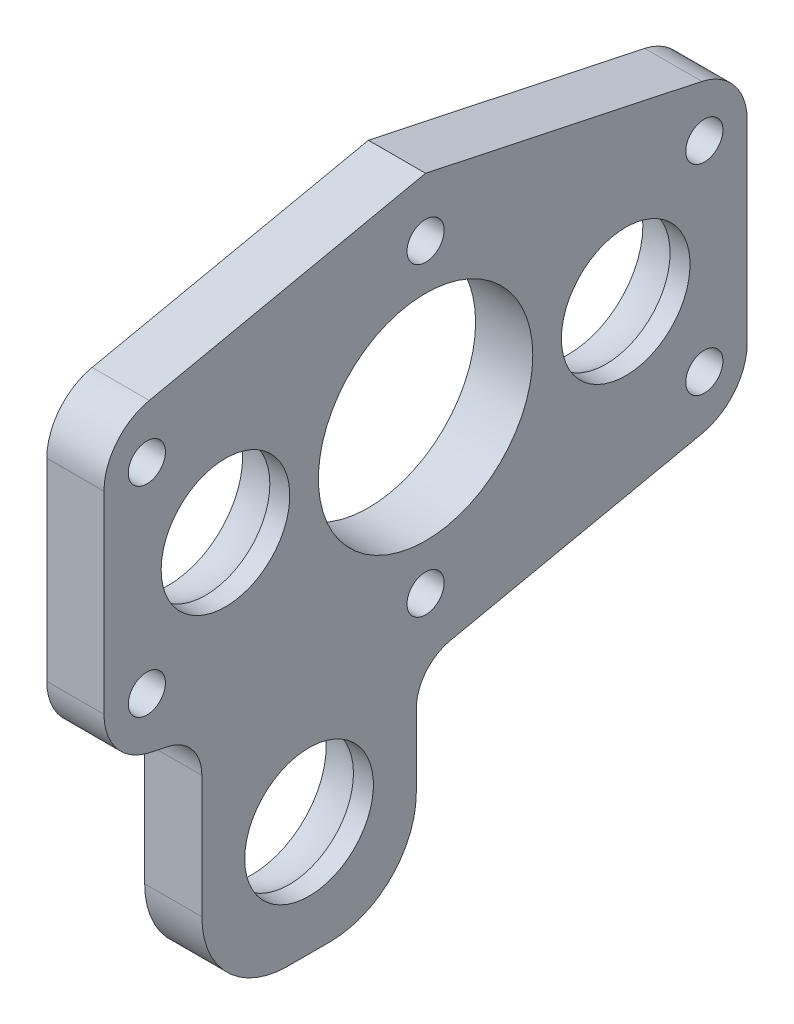
ISO-10303-21;
HEADER;
FILE_DESCRIPTION(('STEP AP214'),'2;1');
FILE_NAME('part.step','',(''),(''),'','','');
FILE_SCHEMA(('AUTOMOTIVE_DESIGN { 1 0 10303 214 1 1 1 1 }'));
ENDSEC;
DATA;
#1=APPLICATION_CONTEXT('core data for automotive mechanical design processes');
#2=APPLICATION_PROTOCOL_DEFINITION('international standard','automotive_design',2000,#1);
#3=PRODUCT_CONTEXT('',#1,'mechanical');
#4=PRODUCT('Part','Part','',(#3));
#5=PRODUCT_RELATED_PRODUCT_CATEGORY('part','',(#4));
#6=PRODUCT_DEFINITION_FORMATION('','',#4);
#7=PRODUCT_DEFINITION_CONTEXT('part definition',#1,'design');
#8=PRODUCT_DEFINITION('design','',#6,#7);
#9=PRODUCT_DEFINITION_SHAPE('','',#8);
#10=(LENGTH_UNIT() NAMED_UNIT(*) SI_UNIT(.MILLI.,.METRE.));
#11=(NAMED_UNIT(*) PLANE_ANGLE_UNIT() SI_UNIT($,.RADIAN.));
#12=(NAMED_UNIT(*) SI_UNIT($,.STERADIAN.) SOLID_ANGLE_UNIT());
#13=UNCERTAINTY_MEASURE_WITH_UNIT(LENGTH_MEASURE(1.E-05),#10,'distance_accuracy_value','');
#14=(GEOMETRIC_REPRESENTATION_CONTEXT(3) GLOBAL_UNCERTAINTY_ASSIGNED_CONTEXT((#13)) GLOBAL_UNIT_ASSIGNED_CONTEXT((#10,
#11,#12)) REPRESENTATION_CONTEXT('',''));
#15=CARTESIAN_POINT('',(0.,0.,0.));
#16=DIRECTION('',(0.,0.,1.));
#17=DIRECTION('',(1.,0.,0.));
#18=AXIS2_PLACEMENT_3D('',#15,#16,#17);
#19=CARTESIAN_POINT('',(4.,-28.2690306373786,-5.99265255801159));
#20=DIRECTION('',(0.,0.978260869565218,0.207378087264554));
#21=DIRECTION('',(0.,-0.207378087264554,0.978260869565218));
#22=AXIS2_PLACEMENT_3D('',#19,#20,#21);
#23=PLANE('',#22);
#24=DIRECTION('',(0.,0.207378087264554,-0.978260869565218));
#25=VECTOR('',#24,1.);
#26=CARTESIAN_POINT('',(4.,-28.2690306373786,-5.99265255801159));
#27=LINE('',#26,#25);
#28=CARTESIAN_POINT('',(4.,-24.4038726556208,-24.2256918251629));
#29=VERTEX_POINT('',#28);
#30=CARTESIAN_POINT('',(4.,-20.672100546187,-41.8295123490582));
#31=VERTEX_POINT('',#30);
#32=EDGE_CURVE('E184',#29,#31,#27,.T.);
#33=ORIENTED_EDGE('',*,*,#32,.T.);
#34=DIRECTION('',(1.,0.,0.));
#35=VECTOR('',#34,1.);
#36=CARTESIAN_POINT('',(4.,-20.672100546187,-41.8295123490582));
#37=LINE('',#36,#35);
#38=CARTESIAN_POINT('',(8.,-20.672100546187,-41.8295123490582));
#39=VERTEX_POINT('',#38);
#40=EDGE_CURVE('E309',#39,#31,#37,.F.);
#41=ORIENTED_EDGE('',*,*,#40,.F.);
#42=DIRECTION('',(0.,0.207378087264554,-0.978260869565218));
#43=VECTOR('',#42,1.);
#44=CARTESIAN_POINT('',(8.,-28.2690306373786,-5.99265255801159));
#45=LINE('',#44,#43);
#46=CARTESIAN_POINT('',(8.,-24.4038726556208,-24.2256918251629));
#47=VERTEX_POINT('',#46);
#48=EDGE_CURVE('E210',#47,#39,#45,.T.);
#49=ORIENTED_EDGE('',*,*,#48,.F.);
#50=DIRECTION('',(1.,0.,0.));
#51=VECTOR('',#50,1.);
#52=CARTESIAN_POINT('',(4.,-24.4038726556208,-24.2256918251629));
#53=LINE('',#52,#51);
#54=EDGE_CURVE('E323',#29,#47,#53,.T.);
#55=ORIENTED_EDGE('',*,*,#54,.F.);
#56=EDGE_LOOP('',(#33,#41,#49,#55));
#57=FACE_BOUND('',#56,.T.);
#58=ADVANCED_FACE('F37',(#57),#23,.F.);
#59=CARTESIAN_POINT('',(4.,0.,-45.));
#60=DIRECTION('',(0.,0.,-1.));
#61=DIRECTION('',(1.,0.,0.));
#62=AXIS2_PLACEMENT_3D('',#59,#60,#61);
#63=PLANE('',#62);
#64=DIRECTION('',(0.,-1.,0.));
#65=VECTOR('',#64,1.);
#66=CARTESIAN_POINT('',(4.,0.,-45.));
#67=LINE('',#66,#65);
#68=CARTESIAN_POINT('',(4.,-3.24094293207383,-45.));
#69=VERTEX_POINT('',#68);
#70=CARTESIAN_POINT('',(4.,-16.7590570679262,-45.));
#71=VERTEX_POINT('',#70);
#72=EDGE_CURVE('E181',#69,#71,#67,.T.);
#73=ORIENTED_EDGE('',*,*,#72,.F.);
#74=DIRECTION('',(1.,0.,0.));
#75=VECTOR('',#74,1.);
#76=CARTESIAN_POINT('',(4.,-3.24094293207383,-45.));
#77=LINE('',#76,#75);
#78=CARTESIAN_POINT('',(8.,-3.24094293207383,-45.));
#79=VERTEX_POINT('',#78);
#80=EDGE_CURVE('E303',#79,#69,#77,.F.);
#81=ORIENTED_EDGE('',*,*,#80,.F.);
#82=DIRECTION('',(0.,-1.,0.));
#83=VECTOR('',#82,1.);
#84=CARTESIAN_POINT('',(8.,0.,-45.));
#85=LINE('',#84,#83);
#86=CARTESIAN_POINT('',(8.,-16.7590570679262,-45.));
#87=VERTEX_POINT('',#86);
#88=EDGE_CURVE('E213',#79,#87,#85,.T.);
#89=ORIENTED_EDGE('',*,*,#88,.T.);
#90=DIRECTION('',(1.,0.,0.));
#91=VECTOR('',#90,1.);
#92=CARTESIAN_POINT('',(8.,-16.7590570679262,-45.));
#93=LINE('',#92,#91);
#94=EDGE_CURVE('E306',#71,#87,#93,.T.);
#95=ORIENTED_EDGE('',*,*,#94,.F.);
#96=EDGE_LOOP('',(#73,#81,#89,#95));
#97=FACE_BOUND('',#96,.T.);
#98=ADVANCED_FACE('F375',(#97),#63,.T.);
#99=CARTESIAN_POINT('',(4.,9.12914405892871,-1.93525519848772));
#100=DIRECTION('',(0.,0.978260869565218,-0.207378087264554));
#101=DIRECTION('',(0.,0.207378087264554,0.978260869565218));
#102=AXIS2_PLACEMENT_3D('',#99,#100,#101);
#103=PLANE('',#102);
#104=DIRECTION('',(0.,-0.207378087264554,-0.978260869565218));
#105=VECTOR('',#104,1.);
#106=CARTESIAN_POINT('',(4.,9.12914405892871,-1.93525519848772));
#107=LINE('',#106,#105);
#108=CARTESIAN_POINT('',(4.,4.76969600708473,-22.5));
#109=VERTEX_POINT('',#108);
#110=CARTESIAN_POINT('',(4.,0.672100546187042,-41.8295123490582));
#111=VERTEX_POINT('',#110);
#112=EDGE_CURVE('E158',#109,#111,#107,.T.);
#113=ORIENTED_EDGE('',*,*,#112,.F.);
#114=DIRECTION('',(1.,0.,0.));
#115=VECTOR('',#114,1.);
#116=CARTESIAN_POINT('',(4.,4.76969600708473,-22.5));
#117=LINE('',#116,#115);
#118=CARTESIAN_POINT('',(8.,4.76969600708473,-22.5));
#119=VERTEX_POINT('',#118);
#120=EDGE_CURVE('E167',#109,#119,#117,.T.);
#121=ORIENTED_EDGE('',*,*,#120,.T.);
#122=DIRECTION('',(0.,-0.207378087264554,-0.978260869565218));
#123=VECTOR('',#122,1.);
#124=CARTESIAN_POINT('',(8.,9.12914405892871,-1.93525519848772));
#125=LINE('',#124,#123);
#126=CARTESIAN_POINT('',(8.,0.672100546187042,-41.8295123490582));
#127=VERTEX_POINT('',#126);
#128=EDGE_CURVE('E217',#119,#127,#125,.T.);
#129=ORIENTED_EDGE('',*,*,#128,.T.);
#130=DIRECTION('',(1.,0.,0.));
#131=VECTOR('',#130,1.);
#132=CARTESIAN_POINT('',(4.,0.672100546187044,-41.8295123490582));
#133=LINE('',#132,#131);
#134=EDGE_CURVE('E180',#111,#127,#133,.T.);
#135=ORIENTED_EDGE('',*,*,#134,.F.);
#136=EDGE_LOOP('',(#113,#121,#129,#135));
#137=FACE_BOUND('',#136,.T.);
#138=ADVANCED_FACE('F178',(#137),#103,.T.);
#139=CARTESIAN_POINT('',(4.,0.,0.));
#140=DIRECTION('',(0.,0.978260869565218,0.207378087264554));
#141=DIRECTION('',(0.,-0.207378087264554,0.978260869565218));
#142=AXIS2_PLACEMENT_3D('',#139,#140,#141);
#143=PLANE('',#142);
#144=DIRECTION('',(0.,0.207378087264554,-0.978260869565218));
#145=VECTOR('',#144,1.);
#146=CARTESIAN_POINT('',(8.,0.,0.));
#147=LINE('',#146,#145);
#148=CARTESIAN_POINT('',(8.,0.672100546187044,-3.17048765094179));
#149=VERTEX_POINT('',#148);
#150=EDGE_CURVE('E170',#149,#119,#147,.T.);
#151=ORIENTED_EDGE('',*,*,#150,.T.);
#152=ORIENTED_EDGE('',*,*,#120,.F.);
#153=DIRECTION('',(0.,0.207378087264554,-0.978260869565218));
#154=VECTOR('',#153,1.);
#155=CARTESIAN_POINT('',(4.,0.,0.));
#156=LINE('',#155,#154);
#157=CARTESIAN_POINT('',(4.,0.672100546187044,-3.17048765094179));
#158=VERTEX_POINT('',#157);
#159=EDGE_CURVE('E153',#158,#109,#156,.T.);
#160=ORIENTED_EDGE('',*,*,#159,.F.);
#161=DIRECTION('',(1.,0.,0.));
#162=VECTOR('',#161,1.);
#163=CARTESIAN_POINT('',(4.,0.672100546187044,-3.17048765094179));
#164=LINE('',#163,#162);
#165=EDGE_CURVE('E291',#149,#158,#164,.F.);
#166=ORIENTED_EDGE('',*,*,#165,.F.);
#167=EDGE_LOOP('',(#151,#152,#160,#166));
#168=FACE_BOUND('',#167,.T.);
#169=ADVANCED_FACE('F168',(#168),#143,.T.);
#170=CARTESIAN_POINT('',(4.,0.,0.));
#171=DIRECTION('',(0.,0.,-1.));
#172=DIRECTION('',(0.,1.,0.));
#173=AXIS2_PLACEMENT_3D('',#170,#171,#172);
#174=PLANE('',#173);
#175=DIRECTION('',(0.,-1.,0.));
#176=VECTOR('',#175,1.);
#177=CARTESIAN_POINT('',(4.,0.,0.));
#178=LINE('',#177,#176);
#179=CARTESIAN_POINT('',(4.,-3.24094293207383,0.));
#180=VERTEX_POINT('',#179);
#181=CARTESIAN_POINT('',(4.,-16.7590570679262,0.));
#182=VERTEX_POINT('',#181);
#183=EDGE_CURVE('E164',#180,#182,#178,.T.);
#184=ORIENTED_EDGE('',*,*,#183,.T.);
#185=DIRECTION('',(1.,0.,0.));
#186=VECTOR('',#185,1.);
#187=CARTESIAN_POINT('',(4.,-16.7590570679262,0.));
#188=LINE('',#187,#186);
#189=CARTESIAN_POINT('',(8.,-16.7590570679262,0.));
#190=VERTEX_POINT('',#189);
#191=EDGE_CURVE('E277',#190,#182,#188,.F.);
#192=ORIENTED_EDGE('',*,*,#191,.F.);
#193=DIRECTION('',(0.,-1.,0.));
#194=VECTOR('',#193,1.);
#195=CARTESIAN_POINT('',(8.,0.,0.));
#196=LINE('',#195,#194);
#197=CARTESIAN_POINT('',(8.,-3.24094293207383,0.));
#198=VERTEX_POINT('',#197);
#199=EDGE_CURVE('E220',#198,#190,#196,.T.);
#200=ORIENTED_EDGE('',*,*,#199,.F.);
#201=DIRECTION('',(1.,0.,0.));
#202=VECTOR('',#201,1.);
#203=CARTESIAN_POINT('',(8.,-3.24094293207383,0.));
#204=LINE('',#203,#202);
#205=EDGE_CURVE('E280',#180,#198,#204,.T.);
#206=ORIENTED_EDGE('',*,*,#205,.F.);
#207=EDGE_LOOP('',(#184,#192,#200,#206));
#208=FACE_BOUND('',#207,.T.);
#209=ADVANCED_FACE('F384',(#208),#174,.F.);
#210=CARTESIAN_POINT('',(4.,-3.,-3.));
#211=DIRECTION('',(1.,0.,0.));
#212=DIRECTION('',(0.,0.,1.));
#213=AXIS2_PLACEMENT_3D('',#210,#211,#212);
#214=CYLINDRICAL_SURFACE('',#213,1.3);
#215=CARTESIAN_POINT('',(4.,-3.,-3.));
#216=DIRECTION('',(1.,0.,0.));
#217=DIRECTION('',(0.,0.,-1.));
#218=AXIS2_PLACEMENT_3D('',#215,#216,#217);
#219=CIRCLE('',#218,1.3);
#220=CARTESIAN_POINT('',(4.,-3.,-4.3));
#221=VERTEX_POINT('',#220);
#222=EDGE_CURVE('E205',#221,#221,#219,.T.);
#223=ORIENTED_EDGE('',*,*,#222,.F.);
#224=EDGE_LOOP('',(#223));
#225=FACE_BOUND('',#224,.T.);
#226=CARTESIAN_POINT('',(8.,-3.,-3.));
#227=DIRECTION('',(1.,0.,0.));
#228=DIRECTION('',(0.,0.,-1.));
#229=AXIS2_PLACEMENT_3D('',#226,#227,#228);
#230=CIRCLE('',#229,1.3);
#231=CARTESIAN_POINT('',(8.,-3.,-4.3));
#232=VERTEX_POINT('',#231);
#233=EDGE_CURVE('E238',#232,#232,#230,.T.);
#234=ORIENTED_EDGE('',*,*,#233,.T.);
#235=EDGE_LOOP('',(#234));
#236=FACE_BOUND('',#235,.T.);
#237=ADVANCED_FACE('F665',(#225,#236),#214,.F.);
#238=CARTESIAN_POINT('',(4.,-3.,-42.));
#239=DIRECTION('',(1.,0.,0.));
#240=DIRECTION('',(0.,0.,1.));
#241=AXIS2_PLACEMENT_3D('',#238,#239,#240);
#242=CYLINDRICAL_SURFACE('',#241,1.29999999999999);
#243=CARTESIAN_POINT('',(4.,-3.,-42.));
#244=DIRECTION('',(1.,0.,0.));
#245=DIRECTION('',(0.,0.,-1.));
#246=AXIS2_PLACEMENT_3D('',#243,#244,#245);
#247=CIRCLE('',#246,1.29999999999999);
#248=CARTESIAN_POINT('',(4.,-3.,-43.3));
#249=VERTEX_POINT('',#248);
#250=EDGE_CURVE('E202',#249,#249,#247,.T.);
#251=ORIENTED_EDGE('',*,*,#250,.F.);
#252=EDGE_LOOP('',(#251));
#253=FACE_BOUND('',#252,.T.);
#254=CARTESIAN_POINT('',(8.,-3.,-42.));
#255=DIRECTION('',(1.,0.,0.));
#256=DIRECTION('',(0.,0.,-1.));
#257=AXIS2_PLACEMENT_3D('',#254,#255,#256);
#258=CIRCLE('',#257,1.29999999999999);
#259=CARTESIAN_POINT('',(8.,-3.,-43.3));
#260=VERTEX_POINT('',#259);
#261=EDGE_CURVE('E235',#260,#260,#258,.T.);
#262=ORIENTED_EDGE('',*,*,#261,.T.);
#263=EDGE_LOOP('',(#262));
#264=FACE_BOUND('',#263,.T.);
#265=ADVANCED_FACE('F655',(#253,#264),#242,.F.);
#266=CARTESIAN_POINT('',(4.,-17.,-42.0000000000003));
#267=DIRECTION('',(1.,0.,0.));
#268=DIRECTION('',(0.,0.,1.));
#269=AXIS2_PLACEMENT_3D('',#266,#267,#268);
#270=CYLINDRICAL_SURFACE('',#269,1.3);
#271=CARTESIAN_POINT('',(4.,-17.,-42.0000000000003));
#272=DIRECTION('',(1.,0.,0.));
#273=DIRECTION('',(0.,0.,-1.));
#274=AXIS2_PLACEMENT_3D('',#271,#272,#273);
#275=CIRCLE('',#274,1.3);
#276=CARTESIAN_POINT('',(4.,-17.,-43.3000000000003));
#277=VERTEX_POINT('',#276);
#278=EDGE_CURVE('E199',#277,#277,#275,.T.);
#279=ORIENTED_EDGE('',*,*,#278,.F.);
#280=EDGE_LOOP('',(#279));
#281=FACE_BOUND('',#280,.T.);
#282=CARTESIAN_POINT('',(8.,-17.,-42.0000000000003));
#283=DIRECTION('',(1.,0.,0.));
#284=DIRECTION('',(0.,0.,-1.));
#285=AXIS2_PLACEMENT_3D('',#282,#283,#284);
#286=CIRCLE('',#285,1.3);
#287=CARTESIAN_POINT('',(8.,-17.,-43.3000000000003));
#288=VERTEX_POINT('',#287);
#289=EDGE_CURVE('E232',#288,#288,#286,.T.);
#290=ORIENTED_EDGE('',*,*,#289,.T.);
#291=EDGE_LOOP('',(#290));
#292=FACE_BOUND('',#291,.T.);
#293=ADVANCED_FACE('F645',(#281,#292),#270,.F.);
#294=CARTESIAN_POINT('',(4.,-17.,-3.00000000000015));
#295=DIRECTION('',(1.,0.,0.));
#296=DIRECTION('',(0.,0.,1.));
#297=AXIS2_PLACEMENT_3D('',#294,#295,#296);
#298=CYLINDRICAL_SURFACE('',#297,1.3);
#299=CARTESIAN_POINT('',(4.,-17.,-3.00000000000015));
#300=DIRECTION('',(1.,0.,0.));
#301=DIRECTION('',(0.,0.,-1.));
#302=AXIS2_PLACEMENT_3D('',#299,#300,#301);
#303=CIRCLE('',#302,1.3);
#304=CARTESIAN_POINT('',(4.,-17.,-4.30000000000015));
#305=VERTEX_POINT('',#304);
#306=EDGE_CURVE('E196',#305,#305,#303,.T.);
#307=ORIENTED_EDGE('',*,*,#306,.F.);
#308=EDGE_LOOP('',(#307));
#309=FACE_BOUND('',#308,.T.);
#310=CARTESIAN_POINT('',(8.,-17.,-3.00000000000015));
#311=DIRECTION('',(1.,0.,0.));
#312=DIRECTION('',(0.,0.,-1.));
#313=AXIS2_PLACEMENT_3D('',#310,#311,#312);
#314=CIRCLE('',#313,1.3);
#315=CARTESIAN_POINT('',(8.,-17.,-4.30000000000015));
#316=VERTEX_POINT('',#315);
#317=EDGE_CURVE('E229',#316,#316,#314,.T.);
#318=ORIENTED_EDGE('',*,*,#317,.T.);
#319=EDGE_LOOP('',(#318));
#320=FACE_BOUND('',#319,.T.);
#321=ADVANCED_FACE('F635',(#309,#320),#298,.F.);
#322=CARTESIAN_POINT('',(4.,-20.6808071181958,-22.5));
#323=DIRECTION('',(1.,0.,0.));
#324=DIRECTION('',(0.,0.,1.));
#325=AXIS2_PLACEMENT_3D('',#322,#323,#324);
#326=CYLINDRICAL_SURFACE('',#325,1.3);
#327=CARTESIAN_POINT('',(4.,-20.6808071181958,-22.5));
#328=DIRECTION('',(1.,0.,0.));
#329=DIRECTION('',(0.,0.,-1.));
#330=AXIS2_PLACEMENT_3D('',#327,#328,#329);
#331=CIRCLE('',#330,1.3);
#332=CARTESIAN_POINT('',(4.,-20.6808071181958,-23.8));
#333=VERTEX_POINT('',#332);
#334=EDGE_CURVE('E193',#333,#333,#331,.T.);
#335=ORIENTED_EDGE('',*,*,#334,.F.);
#336=EDGE_LOOP('',(#335));
#337=FACE_BOUND('',#336,.T.);
#338=CARTESIAN_POINT('',(8.,-20.6808071181958,-22.5));
#339=DIRECTION('',(1.,0.,0.));
#340=DIRECTION('',(0.,0.,-1.));
#341=AXIS2_PLACEMENT_3D('',#338,#339,#340);
#342=CIRCLE('',#341,1.3);
#343=CARTESIAN_POINT('',(8.,-20.6808071181958,-23.8));
#344=VERTEX_POINT('',#343);
#345=EDGE_CURVE('E226',#344,#344,#342,.T.);
#346=ORIENTED_EDGE('',*,*,#345,.T.);
#347=EDGE_LOOP('',(#346));
#348=FACE_BOUND('',#347,.T.);
#349=ADVANCED_FACE('F626',(#337,#348),#326,.F.);
#350=CARTESIAN_POINT('',(4.,-19.1398865784499,4.05739735952387));
#351=DIRECTION('',(0.,0.978260869565218,-0.207378087264554));
#352=DIRECTION('',(0.,0.207378087264554,0.978260869565218));
#353=AXIS2_PLACEMENT_3D('',#350,#351,#352);
#354=PLANE('',#353);
#355=DIRECTION('',(0.,-0.207378087264554,-0.978260869565218));
#356=VECTOR('',#355,1.);
#357=CARTESIAN_POINT('',(8.,-19.1398865784499,4.05739735952387));
#358=LINE('',#357,#356);
#359=CARTESIAN_POINT('',(8.,-20.672100546187,-3.17048765094179));
#360=VERTEX_POINT('',#359);
#361=CARTESIAN_POINT('',(8.,-20.9475712012116,-4.46996034875019));
#362=VERTEX_POINT('',#361);
#363=EDGE_CURVE('E223',#360,#362,#358,.T.);
#364=ORIENTED_EDGE('',*,*,#363,.F.);
#365=DIRECTION('',(1.,0.,0.));
#366=VECTOR('',#365,1.);
#367=CARTESIAN_POINT('',(4.,-20.672100546187,-3.17048765094179));
#368=LINE('',#367,#366);
#369=CARTESIAN_POINT('',(4.,-20.672100546187,-3.17048765094179));
#370=VERTEX_POINT('',#369);
#371=EDGE_CURVE('E300',#370,#360,#368,.T.);
#372=ORIENTED_EDGE('',*,*,#371,.F.);
#373=DIRECTION('',(0.,-0.207378087264554,-0.978260869565218));
#374=VECTOR('',#373,1.);
#375=CARTESIAN_POINT('',(4.,-19.1398865784499,4.05739735952387));
#376=LINE('',#375,#374);
#377=CARTESIAN_POINT('',(4.,-20.9475712012116,-4.46996034875019));
#378=VERTEX_POINT('',#377);
#379=EDGE_CURVE('E190',#370,#378,#376,.T.);
#380=ORIENTED_EDGE('',*,*,#379,.T.);
#381=DIRECTION('',(-1.,0.,0.));
#382=VECTOR('',#381,1.);
#383=CARTESIAN_POINT('',(4.,-20.9475712012116,-4.46996034875019));
#384=LINE('',#383,#382);
#385=EDGE_CURVE('E313',#362,#378,#384,.T.);
#386=ORIENTED_EDGE('',*,*,#385,.F.);
#387=EDGE_LOOP('',(#364,#372,#380,#386));
#388=FACE_BOUND('',#387,.T.);
#389=ADVANCED_FACE('F394',(#388),#354,.F.);
#390=CARTESIAN_POINT('',(4.,0.680807118195841,-22.5));
#391=DIRECTION('',(1.,0.,0.));
#392=DIRECTION('',(0.,0.,1.));
#393=AXIS2_PLACEMENT_3D('',#390,#391,#392);
#394=CYLINDRICAL_SURFACE('',#393,1.3);
#395=CARTESIAN_POINT('',(4.,0.680807118195841,-22.5));
#396=DIRECTION('',(1.,0.,0.));
#397=DIRECTION('',(0.,0.,-1.));
#398=AXIS2_PLACEMENT_3D('',#395,#396,#397);
#399=CIRCLE('',#398,1.3);
#400=CARTESIAN_POINT('',(4.,0.680807118195841,-23.8));
#401=VERTEX_POINT('',#400);
#402=EDGE_CURVE('E175',#401,#401,#399,.T.);
#403=ORIENTED_EDGE('',*,*,#402,.F.);
#404=EDGE_LOOP('',(#403));
#405=FACE_BOUND('',#404,.T.);
#406=CARTESIAN_POINT('',(8.,0.680807118195841,-22.5));
#407=DIRECTION('',(1.,0.,0.));
#408=DIRECTION('',(0.,0.,-1.));
#409=AXIS2_PLACEMENT_3D('',#406,#407,#408);
#410=CIRCLE('',#409,1.3);
#411=CARTESIAN_POINT('',(8.,0.680807118195841,-23.8));
#412=VERTEX_POINT('',#411);
#413=EDGE_CURVE('E241',#412,#412,#410,.T.);
#414=ORIENTED_EDGE('',*,*,#413,.T.);
#415=EDGE_LOOP('',(#414));
#416=FACE_BOUND('',#415,.T.);
#417=ADVANCED_FACE('F426',(#405,#416),#394,.F.);
#418=CARTESIAN_POINT('',(4.,0.,0.));
#419=DIRECTION('',(-1.,0.,0.));
#420=DIRECTION('',(0.,0.,-1.));
#421=AXIS2_PLACEMENT_3D('',#418,#419,#420);
#422=PLANE('',#421);
#423=CARTESIAN_POINT('',(4.,-30.4516466108519,-14.3478260869565));
#424=DIRECTION('',(1.,0.,0.));
#425=DIRECTION('',(0.,0.,-1.));
#426=AXIS2_PLACEMENT_3D('',#423,#424,#425);
#427=CIRCLE('',#426,5.2);
#428=CARTESIAN_POINT('',(4.,-30.4516466108519,-19.5478260869565));
#429=VERTEX_POINT('',#428);
#430=EDGE_CURVE('E256',#429,#429,#427,.T.);
#431=ORIENTED_EDGE('',*,*,#430,.T.);
#432=EDGE_LOOP('',(#431));
#433=FACE_BOUND('',#432,.T.);
#434=CARTESIAN_POINT('',(4.,-10.,-22.5));
#435=DIRECTION('',(1.,0.,0.));
#436=DIRECTION('',(0.,0.,-1.));
#437=AXIS2_PLACEMENT_3D('',#434,#435,#436);
#438=CIRCLE('',#437,7.5);
#439=CARTESIAN_POINT('',(4.,-10.,-30.));
#440=VERTEX_POINT('',#439);
#441=EDGE_CURVE('E247',#440,#440,#438,.T.);
#442=ORIENTED_EDGE('',*,*,#441,.T.);
#443=EDGE_LOOP('',(#442));
#444=FACE_BOUND('',#443,.T.);
#445=CARTESIAN_POINT('',(4.,-10.,-36.5));
#446=DIRECTION('',(1.,0.,0.));
#447=DIRECTION('',(0.,0.,-1.));
#448=AXIS2_PLACEMENT_3D('',#445,#446,#447);
#449=CIRCLE('',#448,5.2);
#450=CARTESIAN_POINT('',(4.,-10.,-41.7));
#451=VERTEX_POINT('',#450);
#452=EDGE_CURVE('E356',#451,#451,#449,.F.);
#453=ORIENTED_EDGE('',*,*,#452,.F.);
#454=EDGE_LOOP('',(#453));
#455=FACE_BOUND('',#454,.T.);
#456=CARTESIAN_POINT('',(4.,-10.,-8.5));
#457=DIRECTION('',(1.,0.,0.));
#458=DIRECTION('',(0.,0.,-1.));
#459=AXIS2_PLACEMENT_3D('',#456,#457,#458);
#460=CIRCLE('',#459,5.2);
#461=CARTESIAN_POINT('',(4.,-10.,-13.7));
#462=VERTEX_POINT('',#461);
#463=EDGE_CURVE('E214',#462,#462,#460,.F.);
#464=ORIENTED_EDGE('',*,*,#463,.F.);
#465=EDGE_LOOP('',(#464));
#466=FACE_BOUND('',#465,.T.);
#467=ORIENTED_EDGE('',*,*,#159,.T.);
#468=ORIENTED_EDGE('',*,*,#112,.T.);
#469=CARTESIAN_POINT('',(4.,-3.24094293207383,-41.));
#470=DIRECTION('',(1.,0.,0.));
#471=DIRECTION('',(0.,0.,-1.));
#472=AXIS2_PLACEMENT_3D('',#469,#470,#471);
#473=CIRCLE('',#472,4.);
#474=EDGE_CURVE('E293',#69,#111,#473,.T.);
#475=ORIENTED_EDGE('',*,*,#474,.F.);
#476=ORIENTED_EDGE('',*,*,#72,.T.);
#477=CARTESIAN_POINT('',(4.,-16.7590570679262,-41.));
#478=DIRECTION('',(1.,0.,0.));
#479=DIRECTION('',(0.,0.,-1.));
#480=AXIS2_PLACEMENT_3D('',#477,#478,#479);
#481=CIRCLE('',#480,4.);
#482=EDGE_CURVE('E295',#31,#71,#481,.T.);
#483=ORIENTED_EDGE('',*,*,#482,.F.);
#484=ORIENTED_EDGE('',*,*,#32,.F.);
#485=CARTESIAN_POINT('',(4.,-27.3386552643165,-24.8478260869565));
#486=DIRECTION('',(1.,0.,0.));
#487=DIRECTION('',(0.,0.,-1.));
#488=AXIS2_PLACEMENT_3D('',#485,#486,#487);
#489=CIRCLE('',#488,3.);
#490=CARTESIAN_POINT('',(4.,-27.3386552643165,-21.8478260869565));
#491=VERTEX_POINT('',#490);
#492=EDGE_CURVE('E11',#491,#29,#489,.F.);
#493=ORIENTED_EDGE('',*,*,#492,.F.);
#494=DIRECTION('',(0.,1.,0.));
#495=VECTOR('',#494,1.);
#496=CARTESIAN_POINT('',(4.,-24.6314439489084,-21.8478260869565));
#497=LINE('',#496,#495);
#498=CARTESIAN_POINT('',(4.,-32.4516466108519,-21.8478260869565));
#499=VERTEX_POINT('',#498);
#500=EDGE_CURVE('E349',#499,#491,#497,.T.);
#501=ORIENTED_EDGE('',*,*,#500,.F.);
#502=CARTESIAN_POINT('',(4.,-32.4516466108519,-15.8478260869565));
#503=DIRECTION('',(1.,0.,0.));
#504=DIRECTION('',(0.,0.,-1.));
#505=AXIS2_PLACEMENT_3D('',#502,#503,#504);
#506=CIRCLE('',#505,6.);
#507=CARTESIAN_POINT('',(4.,-38.4516466108519,-15.8478260869565));
#508=VERTEX_POINT('',#507);
#509=EDGE_CURVE('E264',#508,#499,#506,.T.);
#510=ORIENTED_EDGE('',*,*,#509,.F.);
#511=DIRECTION('',(0.,0.,-1.));
#512=VECTOR('',#511,1.);
#513=CARTESIAN_POINT('',(4.,-38.4516466108519,-21.8478260869565));
#514=LINE('',#513,#512);
#515=CARTESIAN_POINT('',(4.,-38.4516466108519,-12.8478260869565));
#516=VERTEX_POINT('',#515);
#517=EDGE_CURVE('E346',#516,#508,#514,.T.);
#518=ORIENTED_EDGE('',*,*,#517,.F.);
#519=CARTESIAN_POINT('',(4.,-32.4516466108519,-12.8478260869565));
#520=DIRECTION('',(1.,0.,0.));
#521=DIRECTION('',(0.,0.,-1.));
#522=AXIS2_PLACEMENT_3D('',#519,#520,#521);
#523=CIRCLE('',#522,6.);
#524=CARTESIAN_POINT('',(4.,-32.4516466108519,-6.84782608695653));
#525=VERTEX_POINT('',#524);
#526=EDGE_CURVE('E261',#525,#516,#523,.T.);
#527=ORIENTED_EDGE('',*,*,#526,.F.);
#528=DIRECTION('',(0.,-1.,0.));
#529=VECTOR('',#528,1.);
#530=CARTESIAN_POINT('',(4.,-38.4516466108519,-6.84782608695653));
#531=LINE('',#530,#529);
#532=CARTESIAN_POINT('',(4.,-23.8823538099072,-6.84782608695653));
#533=VERTEX_POINT('',#532);
#534=EDGE_CURVE('E343',#533,#525,#531,.T.);
#535=ORIENTED_EDGE('',*,*,#534,.F.);
#536=CARTESIAN_POINT('',(4.,-23.8823538099072,-3.84782608695653));
#537=DIRECTION('',(1.,0.,0.));
#538=DIRECTION('',(0.,0.,-1.));
#539=AXIS2_PLACEMENT_3D('',#536,#537,#538);
#540=CIRCLE('',#539,3.);
#541=EDGE_CURVE('E318',#378,#533,#540,.F.);
#542=ORIENTED_EDGE('',*,*,#541,.F.);
#543=ORIENTED_EDGE('',*,*,#379,.F.);
#544=CARTESIAN_POINT('',(4.,-16.7590570679262,-4.));
#545=DIRECTION('',(1.,0.,0.));
#546=DIRECTION('',(0.,0.,-1.));
#547=AXIS2_PLACEMENT_3D('',#544,#545,#546);
#548=CIRCLE('',#547,4.);
#549=EDGE_CURVE('E297',#182,#370,#548,.T.);
#550=ORIENTED_EDGE('',*,*,#549,.F.);
#551=ORIENTED_EDGE('',*,*,#183,.F.);
#552=CARTESIAN_POINT('',(4.,-3.24094293207383,-4.));
#553=DIRECTION('',(1.,0.,0.));
#554=DIRECTION('',(0.,0.,-1.));
#555=AXIS2_PLACEMENT_3D('',#552,#553,#554);
#556=CIRCLE('',#555,4.);
#557=EDGE_CURVE('E160',#158,#180,#556,.T.);
#558=ORIENTED_EDGE('',*,*,#557,.F.);
#559=EDGE_LOOP('',(#467,#468,#475,#476,#483,#484,#493,#501,#510,#518,#527,#535,#542,#543,#550,
#551,#558));
#560=FACE_BOUND('',#559,.T.);
#561=ORIENTED_EDGE('',*,*,#334,.T.);
#562=EDGE_LOOP('',(#561));
#563=FACE_BOUND('',#562,.T.);
#564=ORIENTED_EDGE('',*,*,#306,.T.);
#565=EDGE_LOOP('',(#564));
#566=FACE_BOUND('',#565,.T.);
#567=ORIENTED_EDGE('',*,*,#278,.T.);
#568=EDGE_LOOP('',(#567));
#569=FACE_BOUND('',#568,.T.);
#570=ORIENTED_EDGE('',*,*,#250,.T.);
#571=EDGE_LOOP('',(#570));
#572=FACE_BOUND('',#571,.T.);
#573=ORIENTED_EDGE('',*,*,#222,.T.);
#574=EDGE_LOOP('',(#573));
#575=FACE_BOUND('',#574,.T.);
#576=ORIENTED_EDGE('',*,*,#402,.T.);
#577=EDGE_LOOP('',(#576));
#578=FACE_BOUND('',#577,.T.);
#579=ADVANCED_FACE('F155',(#433,#444,#455,#466,#560,#563,#566,#569,#572,#575,#578),#422,.T.);
#580=CARTESIAN_POINT('',(8.,0.,0.));
#581=DIRECTION('',(-1.,0.,0.));
#582=DIRECTION('',(0.,0.,-1.));
#583=AXIS2_PLACEMENT_3D('',#580,#581,#582);
#584=PLANE('',#583);
#585=CARTESIAN_POINT('',(8.,-30.4516466108519,-14.3478260869565));
#586=DIRECTION('',(-1.,0.,0.));
#587=DIRECTION('',(0.,0.,1.));
#588=AXIS2_PLACEMENT_3D('',#585,#586,#587);
#589=CIRCLE('',#588,4.5);
#590=CARTESIAN_POINT('',(8.,-30.4516466108519,-9.84782608695653));
#591=VERTEX_POINT('',#590);
#592=EDGE_CURVE('E257',#591,#591,#589,.T.);
#593=ORIENTED_EDGE('',*,*,#592,.T.);
#594=EDGE_LOOP('',(#593));
#595=FACE_BOUND('',#594,.T.);
#596=CARTESIAN_POINT('',(8.,-10.,-36.5));
#597=DIRECTION('',(-1.,0.,0.));
#598=DIRECTION('',(0.,0.,1.));
#599=AXIS2_PLACEMENT_3D('',#596,#597,#598);
#600=CIRCLE('',#599,4.5);
#601=CARTESIAN_POINT('',(8.,-10.,-32.));
#602=VERTEX_POINT('',#601);
#603=EDGE_CURVE('E252',#602,#602,#600,.T.);
#604=ORIENTED_EDGE('',*,*,#603,.T.);
#605=EDGE_LOOP('',(#604));
#606=FACE_BOUND('',#605,.T.);
#607=CARTESIAN_POINT('',(8.,-10.,-8.5));
#608=DIRECTION('',(-1.,0.,0.));
#609=DIRECTION('',(0.,0.,1.));
#610=AXIS2_PLACEMENT_3D('',#607,#608,#609);
#611=CIRCLE('',#610,4.5);
#612=CARTESIAN_POINT('',(8.,-10.,-4.));
#613=VERTEX_POINT('',#612);
#614=EDGE_CURVE('E248',#613,#613,#611,.T.);
#615=ORIENTED_EDGE('',*,*,#614,.T.);
#616=EDGE_LOOP('',(#615));
#617=FACE_BOUND('',#616,.T.);
#618=CARTESIAN_POINT('',(8.,-10.,-22.5));
#619=DIRECTION('',(1.,0.,0.));
#620=DIRECTION('',(0.,0.,-1.));
#621=AXIS2_PLACEMENT_3D('',#618,#619,#620);
#622=CIRCLE('',#621,7.5);
#623=CARTESIAN_POINT('',(8.,-10.,-30.));
#624=VERTEX_POINT('',#623);
#625=EDGE_CURVE('E353',#624,#624,#622,.T.);
#626=ORIENTED_EDGE('',*,*,#625,.F.);
#627=EDGE_LOOP('',(#626));
#628=FACE_BOUND('',#627,.T.);
#629=ORIENTED_EDGE('',*,*,#199,.T.);
#630=CARTESIAN_POINT('',(8.,-16.7590570679262,-4.));
#631=DIRECTION('',(1.,0.,0.));
#632=DIRECTION('',(0.,0.,-1.));
#633=AXIS2_PLACEMENT_3D('',#630,#631,#632);
#634=CIRCLE('',#633,4.);
#635=EDGE_CURVE('E287',#360,#190,#634,.F.);
#636=ORIENTED_EDGE('',*,*,#635,.F.);
#637=ORIENTED_EDGE('',*,*,#363,.T.);
#638=CARTESIAN_POINT('',(8.,-23.8823538099072,-3.84782608695653));
#639=DIRECTION('',(1.,0.,0.));
#640=DIRECTION('',(0.,0.,-1.));
#641=AXIS2_PLACEMENT_3D('',#638,#639,#640);
#642=CIRCLE('',#641,3.);
#643=CARTESIAN_POINT('',(8.,-23.8823538099072,-6.84782608695653));
#644=VERTEX_POINT('',#643);
#645=EDGE_CURVE('E321',#644,#362,#642,.T.);
#646=ORIENTED_EDGE('',*,*,#645,.F.);
#647=DIRECTION('',(0.,-1.,0.));
#648=VECTOR('',#647,1.);
#649=CARTESIAN_POINT('',(8.,-38.4516466108519,-6.84782608695653));
#650=LINE('',#649,#648);
#651=CARTESIAN_POINT('',(8.,-32.4516466108519,-6.84782608695653));
#652=VERTEX_POINT('',#651);
#653=EDGE_CURVE('E339',#644,#652,#650,.T.);
#654=ORIENTED_EDGE('',*,*,#653,.T.);
#655=CARTESIAN_POINT('',(8.,-32.4516466108519,-12.8478260869565));
#656=DIRECTION('',(1.,0.,0.));
#657=DIRECTION('',(0.,0.,-1.));
#658=AXIS2_PLACEMENT_3D('',#655,#656,#657);
#659=CIRCLE('',#658,6.);
#660=CARTESIAN_POINT('',(8.,-38.4516466108519,-12.8478260869565));
#661=VERTEX_POINT('',#660);
#662=EDGE_CURVE('E269',#661,#652,#659,.F.);
#663=ORIENTED_EDGE('',*,*,#662,.F.);
#664=DIRECTION('',(0.,0.,-1.));
#665=VECTOR('',#664,1.);
#666=CARTESIAN_POINT('',(8.,-38.4516466108519,-21.8478260869565));
#667=LINE('',#666,#665);
#668=CARTESIAN_POINT('',(8.,-38.4516466108519,-15.8478260869565));
#669=VERTEX_POINT('',#668);
#670=EDGE_CURVE('E335',#661,#669,#667,.T.);
#671=ORIENTED_EDGE('',*,*,#670,.T.);
#672=CARTESIAN_POINT('',(8.,-32.4516466108519,-15.8478260869565));
#673=DIRECTION('',(1.,0.,0.));
#674=DIRECTION('',(0.,0.,-1.));
#675=AXIS2_PLACEMENT_3D('',#672,#673,#674);
#676=CIRCLE('',#675,6.);
#677=CARTESIAN_POINT('',(8.,-32.4516466108519,-21.8478260869565));
#678=VERTEX_POINT('',#677);
#679=EDGE_CURVE('E272',#678,#669,#676,.F.);
#680=ORIENTED_EDGE('',*,*,#679,.F.);
#681=DIRECTION('',(0.,1.,0.));
#682=VECTOR('',#681,1.);
#683=CARTESIAN_POINT('',(8.,-24.6314439489084,-21.8478260869565));
#684=LINE('',#683,#682);
#685=CARTESIAN_POINT('',(8.,-27.3386552643165,-21.8478260869565));
#686=VERTEX_POINT('',#685);
#687=EDGE_CURVE('E331',#678,#686,#684,.T.);
#688=ORIENTED_EDGE('',*,*,#687,.T.);
#689=CARTESIAN_POINT('',(8.,-27.3386552643165,-24.8478260869565));
#690=DIRECTION('',(1.,0.,0.));
#691=DIRECTION('',(0.,0.,-1.));
#692=AXIS2_PLACEMENT_3D('',#689,#690,#691);
#693=CIRCLE('',#692,3.);
#694=EDGE_CURVE('E45',#47,#686,#693,.T.);
#695=ORIENTED_EDGE('',*,*,#694,.F.);
#696=ORIENTED_EDGE('',*,*,#48,.T.);
#697=CARTESIAN_POINT('',(8.,-16.7590570679262,-41.));
#698=DIRECTION('',(1.,0.,0.));
#699=DIRECTION('',(0.,0.,-1.));
#700=AXIS2_PLACEMENT_3D('',#697,#698,#699);
#701=CIRCLE('',#700,4.);
#702=EDGE_CURVE('E285',#87,#39,#701,.F.);
#703=ORIENTED_EDGE('',*,*,#702,.F.);
#704=ORIENTED_EDGE('',*,*,#88,.F.);
#705=CARTESIAN_POINT('',(8.,-3.24094293207383,-41.));
#706=DIRECTION('',(1.,0.,0.));
#707=DIRECTION('',(0.,0.,-1.));
#708=AXIS2_PLACEMENT_3D('',#705,#706,#707);
#709=CIRCLE('',#708,4.);
#710=EDGE_CURVE('E283',#127,#79,#709,.F.);
#711=ORIENTED_EDGE('',*,*,#710,.F.);
#712=ORIENTED_EDGE('',*,*,#128,.F.);
#713=ORIENTED_EDGE('',*,*,#150,.F.);
#714=CARTESIAN_POINT('',(8.,-3.24094293207383,-4.));
#715=DIRECTION('',(1.,0.,0.));
#716=DIRECTION('',(0.,0.,-1.));
#717=AXIS2_PLACEMENT_3D('',#714,#715,#716);
#718=CIRCLE('',#717,4.);
#719=EDGE_CURVE('E289',#198,#149,#718,.F.);
#720=ORIENTED_EDGE('',*,*,#719,.F.);
#721=EDGE_LOOP('',(#629,#636,#637,#646,#654,#663,#671,#680,#688,#695,#696,#703,#704,#711,#712,
#713,#720));
#722=FACE_BOUND('',#721,.T.);
#723=ORIENTED_EDGE('',*,*,#345,.F.);
#724=EDGE_LOOP('',(#723));
#725=FACE_BOUND('',#724,.T.);
#726=ORIENTED_EDGE('',*,*,#317,.F.);
#727=EDGE_LOOP('',(#726));
#728=FACE_BOUND('',#727,.T.);
#729=ORIENTED_EDGE('',*,*,#289,.F.);
#730=EDGE_LOOP('',(#729));
#731=FACE_BOUND('',#730,.T.);
#732=ORIENTED_EDGE('',*,*,#261,.F.);
#733=EDGE_LOOP('',(#732));
#734=FACE_BOUND('',#733,.T.);
#735=ORIENTED_EDGE('',*,*,#233,.F.);
#736=EDGE_LOOP('',(#735));
#737=FACE_BOUND('',#736,.T.);
#738=ORIENTED_EDGE('',*,*,#413,.F.);
#739=EDGE_LOOP('',(#738));
#740=FACE_BOUND('',#739,.T.);
#741=ADVANCED_FACE('F332',(#595,#606,#617,#628,#722,#725,#728,#731,#734,#737,#740),#584,.F.);
#742=CARTESIAN_POINT('',(4.,-10.,-8.5));
#743=DIRECTION('',(0.,0.,1.));
#744=DIRECTION('',(0.,1.,0.));
#745=AXIS2_PLACEMENT_3D('',#742,#743,#744);
#746=SPHERICAL_SURFACE('',#745,5.2);
#747=CARTESIAN_POINT('',(4.,-10.,-8.5));
#748=DIRECTION('',(1.,0.,0.));
#749=DIRECTION('',(0.,0.,-1.));
#750=AXIS2_PLACEMENT_3D('',#747,#748,#749);
#751=SPHERICAL_SURFACE('',#750,5.2);
#752=CARTESIAN_POINT('',(6.60576284415908,-10.,-8.5));
#753=DIRECTION('',(1.,0.,0.));
#754=DIRECTION('',(0.,0.,-1.));
#755=AXIS2_PLACEMENT_3D('',#752,#753,#754);
#756=CIRCLE('',#755,4.5);
#757=CARTESIAN_POINT('',(6.60576284415908,-10.,-13.));
#758=VERTEX_POINT('',#757);
#759=EDGE_CURVE('E244',#758,#758,#756,.T.);
#760=ORIENTED_EDGE('',*,*,#759,.T.);
#761=EDGE_LOOP('',(#760));
#762=FACE_BOUND('',#761,.T.);
#763=ORIENTED_EDGE('',*,*,#463,.T.);
#764=EDGE_LOOP('',(#763));
#765=FACE_BOUND('',#764,.T.);
#766=ADVANCED_FACE('F434',(#762,#765),#751,.F.);
#767=CARTESIAN_POINT('',(4.,-10.,-36.5));
#768=DIRECTION('',(0.,0.,1.));
#769=DIRECTION('',(0.,1.,0.));
#770=AXIS2_PLACEMENT_3D('',#767,#768,#769);
#771=SPHERICAL_SURFACE('',#770,5.2);
#772=CARTESIAN_POINT('',(4.,-10.,-36.5));
#773=DIRECTION('',(1.,0.,0.));
#774=DIRECTION('',(0.,0.,-1.));
#775=AXIS2_PLACEMENT_3D('',#772,#773,#774);
#776=SPHERICAL_SURFACE('',#775,5.2);
#777=CARTESIAN_POINT('',(6.60576284415906,-10.,-36.5));
#778=DIRECTION('',(1.,0.,0.));
#779=DIRECTION('',(0.,0.,-1.));
#780=AXIS2_PLACEMENT_3D('',#777,#778,#779);
#781=CIRCLE('',#780,4.5);
#782=CARTESIAN_POINT('',(6.60576284415906,-10.,-41.));
#783=VERTEX_POINT('',#782);
#784=EDGE_CURVE('E249',#783,#783,#781,.T.);
#785=ORIENTED_EDGE('',*,*,#784,.T.);
#786=EDGE_LOOP('',(#785));
#787=FACE_BOUND('',#786,.T.);
#788=ORIENTED_EDGE('',*,*,#452,.T.);
#789=EDGE_LOOP('',(#788));
#790=FACE_BOUND('',#789,.T.);
#791=ADVANCED_FACE('F436',(#787,#790),#776,.F.);
#792=CARTESIAN_POINT('',(8.,-10.,-22.5));
#793=DIRECTION('',(-1.,0.,0.));
#794=DIRECTION('',(0.,0.,-1.));
#795=AXIS2_PLACEMENT_3D('',#792,#793,#794);
#796=CYLINDRICAL_SURFACE('',#795,7.5);
#797=ORIENTED_EDGE('',*,*,#625,.T.);
#798=EDGE_LOOP('',(#797));
#799=FACE_BOUND('',#798,.T.);
#800=ORIENTED_EDGE('',*,*,#441,.F.);
#801=EDGE_LOOP('',(#800));
#802=FACE_BOUND('',#801,.T.);
#803=ADVANCED_FACE('F443',(#799,#802),#796,.F.);
#804=CARTESIAN_POINT('',(4.,-10.,-8.5));
#805=DIRECTION('',(1.,0.,0.));
#806=DIRECTION('',(0.,0.,1.));
#807=AXIS2_PLACEMENT_3D('',#804,#805,#806);
#808=CYLINDRICAL_SURFACE('',#807,4.5);
#809=ORIENTED_EDGE('',*,*,#759,.F.);
#810=EDGE_LOOP('',(#809));
#811=FACE_BOUND('',#810,.T.);
#812=ORIENTED_EDGE('',*,*,#614,.F.);
#813=EDGE_LOOP('',(#812));
#814=FACE_BOUND('',#813,.T.);
#815=ADVANCED_FACE('F563',(#811,#814),#808,.F.);
#816=CARTESIAN_POINT('',(4.,-10.,-36.5));
#817=DIRECTION('',(1.,0.,0.));
#818=DIRECTION('',(0.,0.,1.));
#819=AXIS2_PLACEMENT_3D('',#816,#817,#818);
#820=CYLINDRICAL_SURFACE('',#819,4.5);
#821=ORIENTED_EDGE('',*,*,#784,.F.);
#822=EDGE_LOOP('',(#821));
#823=FACE_BOUND('',#822,.T.);
#824=ORIENTED_EDGE('',*,*,#603,.F.);
#825=EDGE_LOOP('',(#824));
#826=FACE_BOUND('',#825,.T.);
#827=ADVANCED_FACE('F554',(#823,#826),#820,.F.);
#828=CARTESIAN_POINT('',(8.,-38.4516466108519,-6.84782608695653));
#829=DIRECTION('',(0.,0.,1.));
#830=DIRECTION('',(-1.,0.,0.));
#831=AXIS2_PLACEMENT_3D('',#828,#829,#830);
#832=PLANE('',#831);
#833=ORIENTED_EDGE('',*,*,#534,.T.);
#834=DIRECTION('',(-1.,0.,0.));
#835=VECTOR('',#834,1.);
#836=CARTESIAN_POINT('',(8.,-32.4516466108519,-6.84782608695653));
#837=LINE('',#836,#835);
#838=EDGE_CURVE('E275',#652,#525,#837,.T.);
#839=ORIENTED_EDGE('',*,*,#838,.F.);
#840=ORIENTED_EDGE('',*,*,#653,.F.);
#841=DIRECTION('',(-1.,0.,0.));
#842=VECTOR('',#841,1.);
#843=CARTESIAN_POINT('',(8.,-23.8823538099072,-6.84782608695653));
#844=LINE('',#843,#842);
#845=EDGE_CURVE('E316',#533,#644,#844,.F.);
#846=ORIENTED_EDGE('',*,*,#845,.F.);
#847=EDGE_LOOP('',(#833,#839,#840,#846));
#848=FACE_BOUND('',#847,.T.);
#849=ADVANCED_FACE('F400',(#848),#832,.T.);
#850=CARTESIAN_POINT('',(8.,-24.6314439489084,-21.8478260869565));
#851=DIRECTION('',(0.,0.,-1.));
#852=DIRECTION('',(1.,0.,0.));
#853=AXIS2_PLACEMENT_3D('',#850,#851,#852);
#854=PLANE('',#853);
#855=ORIENTED_EDGE('',*,*,#687,.F.);
#856=DIRECTION('',(-1.,0.,0.));
#857=VECTOR('',#856,1.);
#858=CARTESIAN_POINT('',(8.,-32.4516466108519,-21.8478260869565));
#859=LINE('',#858,#857);
#860=EDGE_CURVE('E267',#499,#678,#859,.F.);
#861=ORIENTED_EDGE('',*,*,#860,.F.);
#862=ORIENTED_EDGE('',*,*,#500,.T.);
#863=DIRECTION('',(1.,0.,0.));
#864=VECTOR('',#863,1.);
#865=CARTESIAN_POINT('',(8.,-27.3386552643165,-21.8478260869565));
#866=LINE('',#865,#864);
#867=EDGE_CURVE('E51',#686,#491,#866,.F.);
#868=ORIENTED_EDGE('',*,*,#867,.F.);
#869=EDGE_LOOP('',(#855,#861,#862,#868));
#870=FACE_BOUND('',#869,.T.);
#871=ADVANCED_FACE('F536',(#870),#854,.T.);
#872=CARTESIAN_POINT('',(8.,-38.4516466108519,-21.8478260869565));
#873=DIRECTION('',(0.,-1.,0.));
#874=DIRECTION('',(0.,0.,-1.));
#875=AXIS2_PLACEMENT_3D('',#872,#873,#874);
#876=PLANE('',#875);
#877=ORIENTED_EDGE('',*,*,#670,.F.);
#878=DIRECTION('',(-1.,0.,0.));
#879=VECTOR('',#878,1.);
#880=CARTESIAN_POINT('',(8.,-38.4516466108519,-12.8478260869565));
#881=LINE('',#880,#879);
#882=EDGE_CURVE('E174',#516,#661,#881,.F.);
#883=ORIENTED_EDGE('',*,*,#882,.F.);
#884=ORIENTED_EDGE('',*,*,#517,.T.);
#885=DIRECTION('',(-1.,0.,0.));
#886=VECTOR('',#885,1.);
#887=CARTESIAN_POINT('',(8.,-38.4516466108519,-15.8478260869565));
#888=LINE('',#887,#886);
#889=EDGE_CURVE('E259',#669,#508,#888,.T.);
#890=ORIENTED_EDGE('',*,*,#889,.F.);
#891=EDGE_LOOP('',(#877,#883,#884,#890));
#892=FACE_BOUND('',#891,.T.);
#893=ADVANCED_FACE('F420',(#892),#876,.T.);
#894=CARTESIAN_POINT('',(4.,-30.4516466108519,-14.3478260869565));
#895=DIRECTION('',(0.,1.,0.));
#896=DIRECTION('',(0.,0.,-1.));
#897=AXIS2_PLACEMENT_3D('',#894,#895,#896);
#898=SPHERICAL_SURFACE('',#897,5.2);
#899=CARTESIAN_POINT('',(4.,-30.4516466108519,-14.3478260869565));
#900=DIRECTION('',(1.,0.,0.));
#901=DIRECTION('',(0.,0.,-1.));
#902=AXIS2_PLACEMENT_3D('',#899,#900,#901);
#903=SPHERICAL_SURFACE('',#902,5.2);
#904=CARTESIAN_POINT('',(6.60576284415908,-30.4516466108519,-14.3478260869565));
#905=DIRECTION('',(1.,0.,0.));
#906=DIRECTION('',(0.,0.,-1.));
#907=AXIS2_PLACEMENT_3D('',#904,#905,#906);
#908=CIRCLE('',#907,4.5);
#909=CARTESIAN_POINT('',(6.60576284415908,-30.4516466108519,-18.8478260869565));
#910=VERTEX_POINT('',#909);
#911=EDGE_CURVE('E253',#910,#910,#908,.F.);
#912=ORIENTED_EDGE('',*,*,#911,.F.);
#913=EDGE_LOOP('',(#912));
#914=FACE_BOUND('',#913,.T.);
#915=ORIENTED_EDGE('',*,*,#430,.F.);
#916=EDGE_LOOP('',(#915));
#917=FACE_BOUND('',#916,.T.);
#918=ADVANCED_FACE('F414',(#914,#917),#903,.F.);
#919=CARTESIAN_POINT('',(4.,-30.4516466108519,-14.3478260869565));
#920=DIRECTION('',(1.,0.,0.));
#921=DIRECTION('',(0.,0.,1.));
#922=AXIS2_PLACEMENT_3D('',#919,#920,#921);
#923=CYLINDRICAL_SURFACE('',#922,4.5);
#924=ORIENTED_EDGE('',*,*,#592,.F.);
#925=EDGE_LOOP('',(#924));
#926=FACE_BOUND('',#925,.T.);
#927=ORIENTED_EDGE('',*,*,#911,.T.);
#928=EDGE_LOOP('',(#927));
#929=FACE_BOUND('',#928,.T.);
#930=ADVANCED_FACE('F410',(#926,#929),#923,.F.);
#931=CARTESIAN_POINT('',(8.,-32.4516466108519,-15.8478260869565));
#932=DIRECTION('',(-1.,0.,0.));
#933=DIRECTION('',(0.,0.,-1.));
#934=AXIS2_PLACEMENT_3D('',#931,#932,#933);
#935=CYLINDRICAL_SURFACE('',#934,6.);
#936=ORIENTED_EDGE('',*,*,#679,.T.);
#937=ORIENTED_EDGE('',*,*,#889,.T.);
#938=ORIENTED_EDGE('',*,*,#509,.T.);
#939=ORIENTED_EDGE('',*,*,#860,.T.);
#940=EDGE_LOOP('',(#936,#937,#938,#939));
#941=FACE_BOUND('',#940,.T.);
#942=ADVANCED_FACE('F413',(#941),#935,.T.);
#943=CARTESIAN_POINT('',(8.,-32.4516466108519,-12.8478260869565));
#944=DIRECTION('',(-1.,0.,0.));
#945=DIRECTION('',(0.,0.,-1.));
#946=AXIS2_PLACEMENT_3D('',#943,#944,#945);
#947=CYLINDRICAL_SURFACE('',#946,6.);
#948=ORIENTED_EDGE('',*,*,#662,.T.);
#949=ORIENTED_EDGE('',*,*,#838,.T.);
#950=ORIENTED_EDGE('',*,*,#526,.T.);
#951=ORIENTED_EDGE('',*,*,#882,.T.);
#952=EDGE_LOOP('',(#948,#949,#950,#951));
#953=FACE_BOUND('',#952,.T.);
#954=ADVANCED_FACE('F457',(#953),#947,.T.);
#955=CARTESIAN_POINT('',(4.,-3.24094293207383,-4.));
#956=DIRECTION('',(-1.,0.,0.));
#957=DIRECTION('',(0.,0.,-1.));
#958=AXIS2_PLACEMENT_3D('',#955,#956,#957);
#959=CYLINDRICAL_SURFACE('',#958,4.);
#960=ORIENTED_EDGE('',*,*,#557,.T.);
#961=ORIENTED_EDGE('',*,*,#205,.T.);
#962=ORIENTED_EDGE('',*,*,#719,.T.);
#963=ORIENTED_EDGE('',*,*,#165,.T.);
#964=EDGE_LOOP('',(#960,#961,#962,#963));
#965=FACE_BOUND('',#964,.T.);
#966=ADVANCED_FACE('F382',(#965),#959,.T.);
#967=CARTESIAN_POINT('',(4.,-16.7590570679262,-4.));
#968=DIRECTION('',(1.,0.,0.));
#969=DIRECTION('',(0.,0.,1.));
#970=AXIS2_PLACEMENT_3D('',#967,#968,#969);
#971=CYLINDRICAL_SURFACE('',#970,4.);
#972=ORIENTED_EDGE('',*,*,#549,.T.);
#973=ORIENTED_EDGE('',*,*,#371,.T.);
#974=ORIENTED_EDGE('',*,*,#635,.T.);
#975=ORIENTED_EDGE('',*,*,#191,.T.);
#976=EDGE_LOOP('',(#972,#973,#974,#975));
#977=FACE_BOUND('',#976,.T.);
#978=ADVANCED_FACE('F386',(#977),#971,.T.);
#979=CARTESIAN_POINT('',(4.,-16.7590570679262,-41.));
#980=DIRECTION('',(-1.,0.,0.));
#981=DIRECTION('',(0.,0.,-1.));
#982=AXIS2_PLACEMENT_3D('',#979,#980,#981);
#983=CYLINDRICAL_SURFACE('',#982,4.);
#984=ORIENTED_EDGE('',*,*,#482,.T.);
#985=ORIENTED_EDGE('',*,*,#94,.T.);
#986=ORIENTED_EDGE('',*,*,#702,.T.);
#987=ORIENTED_EDGE('',*,*,#40,.T.);
#988=EDGE_LOOP('',(#984,#985,#986,#987));
#989=FACE_BOUND('',#988,.T.);
#990=ADVANCED_FACE('F371',(#989),#983,.T.);
#991=CARTESIAN_POINT('',(4.,-3.24094293207383,-41.));
#992=DIRECTION('',(1.,0.,0.));
#993=DIRECTION('',(0.,0.,1.));
#994=AXIS2_PLACEMENT_3D('',#991,#992,#993);
#995=CYLINDRICAL_SURFACE('',#994,4.);
#996=ORIENTED_EDGE('',*,*,#474,.T.);
#997=ORIENTED_EDGE('',*,*,#134,.T.);
#998=ORIENTED_EDGE('',*,*,#710,.T.);
#999=ORIENTED_EDGE('',*,*,#80,.T.);
#1000=EDGE_LOOP('',(#996,#997,#998,#999));
#1001=FACE_BOUND('',#1000,.T.);
#1002=ADVANCED_FACE('F377',(#1001),#995,.T.);
#1003=CARTESIAN_POINT('',(4.,-23.8823538099072,-3.84782608695653));
#1004=DIRECTION('',(-1.,0.,0.));
#1005=DIRECTION('',(0.,0.,-1.));
#1006=AXIS2_PLACEMENT_3D('',#1003,#1004,#1005);
#1007=CYLINDRICAL_SURFACE('',#1006,3.);
#1008=ORIENTED_EDGE('',*,*,#645,.T.);
#1009=ORIENTED_EDGE('',*,*,#385,.T.);
#1010=ORIENTED_EDGE('',*,*,#541,.T.);
#1011=ORIENTED_EDGE('',*,*,#845,.T.);
#1012=EDGE_LOOP('',(#1008,#1009,#1010,#1011));
#1013=FACE_BOUND('',#1012,.T.);
#1014=ADVANCED_FACE('F396',(#1013),#1007,.F.);
#1015=CARTESIAN_POINT('',(4.,-27.3386552643165,-24.8478260869565));
#1016=DIRECTION('',(1.,0.,0.));
#1017=DIRECTION('',(0.,0.,1.));
#1018=AXIS2_PLACEMENT_3D('',#1015,#1016,#1017);
#1019=CYLINDRICAL_SURFACE('',#1018,3.);
#1020=ORIENTED_EDGE('',*,*,#492,.T.);
#1021=ORIENTED_EDGE('',*,*,#54,.T.);
#1022=ORIENTED_EDGE('',*,*,#694,.T.);
#1023=ORIENTED_EDGE('',*,*,#867,.T.);
#1024=EDGE_LOOP('',(#1020,#1021,#1022,#1023));
#1025=FACE_BOUND('',#1024,.T.);
#1026=ADVANCED_FACE('F39',(#1025),#1019,.F.);
#1027=CLOSED_SHELL('',(#58,#98,#138,#169,#209,#237,#265,#293,#321,#349,#389,#417,#579,#741,#766,
#791,#803,#815,#827,#849,#871,#893,#918,#930,#942,#954,#966,#978,#990,#1002,#1014,#1026));
#1028=MANIFOLD_SOLID_BREP('B2',#1027);
#1029=ADVANCED_BREP_SHAPE_REPRESENTATION('',(#18,#1028),#14);
#1030=SHAPE_DEFINITION_REPRESENTATION(#9,#1029);
ENDSEC;
END-ISO-10303-21;
